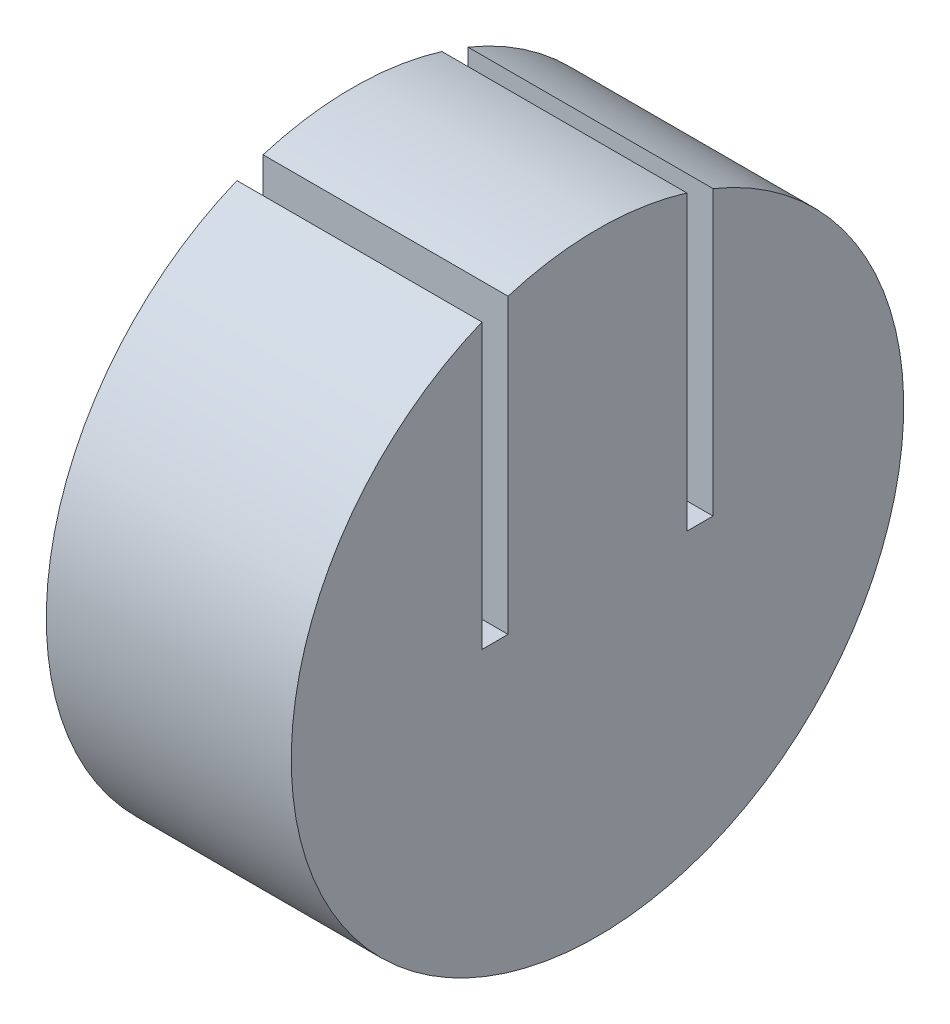
ISO-10303-21;
HEADER;
FILE_DESCRIPTION(('STEP AP214'),'2;1');
FILE_NAME('part.step','',(''),(''),'','','');
FILE_SCHEMA(('AUTOMOTIVE_DESIGN { 1 0 10303 214 1 1 1 1 }'));
ENDSEC;
DATA;
#1=APPLICATION_CONTEXT('core data for automotive mechanical design processes');
#2=APPLICATION_PROTOCOL_DEFINITION('international standard','automotive_design',2000,#1);
#3=PRODUCT_CONTEXT('',#1,'mechanical');
#4=PRODUCT('Part','Part','',(#3));
#5=PRODUCT_RELATED_PRODUCT_CATEGORY('part','',(#4));
#6=PRODUCT_DEFINITION_FORMATION('','',#4);
#7=PRODUCT_DEFINITION_CONTEXT('part definition',#1,'design');
#8=PRODUCT_DEFINITION('design','',#6,#7);
#9=PRODUCT_DEFINITION_SHAPE('','',#8);
#10=(LENGTH_UNIT() NAMED_UNIT(*) SI_UNIT(.MILLI.,.METRE.));
#11=(NAMED_UNIT(*) PLANE_ANGLE_UNIT() SI_UNIT($,.RADIAN.));
#12=(NAMED_UNIT(*) SI_UNIT($,.STERADIAN.) SOLID_ANGLE_UNIT());
#13=UNCERTAINTY_MEASURE_WITH_UNIT(LENGTH_MEASURE(1.E-05),#10,'distance_accuracy_value','');
#14=(GEOMETRIC_REPRESENTATION_CONTEXT(3) GLOBAL_UNCERTAINTY_ASSIGNED_CONTEXT((#13)) GLOBAL_UNIT_ASSIGNED_CONTEXT((#10,
#11,#12)) REPRESENTATION_CONTEXT('',''));
#15=CARTESIAN_POINT('',(0.,0.,0.));
#16=DIRECTION('',(0.,0.,1.));
#17=DIRECTION('',(1.,0.,0.));
#18=AXIS2_PLACEMENT_3D('',#15,#16,#17);
#19=CARTESIAN_POINT('',(7.62,0.,2.7813));
#20=DIRECTION('',(0.,0.,-1.));
#21=DIRECTION('',(0.,1.,0.));
#22=AXIS2_PLACEMENT_3D('',#19,#20,#21);
#23=PLANE('',#22);
#24=DIRECTION('',(0.,-1.,0.));
#25=VECTOR('',#24,1.);
#26=CARTESIAN_POINT('',(0.,0.,2.7813));
#27=LINE('',#26,#25);
#28=CARTESIAN_POINT('',(0.,9.10988448389989,2.7813));
#29=VERTEX_POINT('',#28);
#30=CARTESIAN_POINT('',(0.,0.,2.7813));
#31=VERTEX_POINT('',#30);
#32=EDGE_CURVE('E181',#29,#31,#27,.T.);
#33=ORIENTED_EDGE('',*,*,#32,.T.);
#34=DIRECTION('',(-1.,0.,0.));
#35=VECTOR('',#34,1.);
#36=CARTESIAN_POINT('',(7.62,0.,2.7813));
#37=LINE('',#36,#35);
#38=CARTESIAN_POINT('',(7.62,0.,2.7813));
#39=VERTEX_POINT('',#38);
#40=EDGE_CURVE('E11',#39,#31,#37,.T.);
#41=ORIENTED_EDGE('',*,*,#40,.F.);
#42=DIRECTION('',(0.,-1.,0.));
#43=VECTOR('',#42,1.);
#44=CARTESIAN_POINT('',(7.62,0.,2.7813));
#45=LINE('',#44,#43);
#46=CARTESIAN_POINT('',(7.62,9.10988448389989,2.7813));
#47=VERTEX_POINT('',#46);
#48=EDGE_CURVE('E97',#47,#39,#45,.T.);
#49=ORIENTED_EDGE('',*,*,#48,.F.);
#50=DIRECTION('',(-1.,0.,0.));
#51=VECTOR('',#50,1.);
#52=CARTESIAN_POINT('',(7.62,9.10988448389989,2.7813));
#53=LINE('',#52,#51);
#54=EDGE_CURVE('E154',#47,#29,#53,.T.);
#55=ORIENTED_EDGE('',*,*,#54,.T.);
#56=EDGE_LOOP('',(#33,#41,#49,#55));
#57=FACE_BOUND('',#56,.T.);
#58=ADVANCED_FACE('F41',(#57),#23,.F.);
#59=CARTESIAN_POINT('',(7.62,0.,0.));
#60=DIRECTION('',(0.,1.,0.));
#61=DIRECTION('',(0.,0.,1.));
#62=AXIS2_PLACEMENT_3D('',#59,#60,#61);
#63=PLANE('',#62);
#64=DIRECTION('',(0.,0.,-1.));
#65=VECTOR('',#64,1.);
#66=CARTESIAN_POINT('',(0.,0.,0.));
#67=LINE('',#66,#65);
#68=CARTESIAN_POINT('',(0.,0.,3.5941));
#69=VERTEX_POINT('',#68);
#70=EDGE_CURVE('E175',#69,#31,#67,.T.);
#71=ORIENTED_EDGE('',*,*,#70,.F.);
#72=DIRECTION('',(-1.,0.,0.));
#73=VECTOR('',#72,1.);
#74=CARTESIAN_POINT('',(7.62,0.,3.5941));
#75=LINE('',#74,#73);
#76=CARTESIAN_POINT('',(7.62,0.,3.5941));
#77=VERTEX_POINT('',#76);
#78=EDGE_CURVE('E50',#77,#69,#75,.T.);
#79=ORIENTED_EDGE('',*,*,#78,.F.);
#80=DIRECTION('',(0.,0.,-1.));
#81=VECTOR('',#80,1.);
#82=CARTESIAN_POINT('',(7.62,0.,0.));
#83=LINE('',#82,#81);
#84=EDGE_CURVE('E135',#77,#39,#83,.T.);
#85=ORIENTED_EDGE('',*,*,#84,.T.);
#86=ORIENTED_EDGE('',*,*,#40,.T.);
#87=EDGE_LOOP('',(#71,#79,#85,#86));
#88=FACE_BOUND('',#87,.T.);
#89=ADVANCED_FACE('F176',(#88),#63,.T.);
#90=CARTESIAN_POINT('',(7.62,0.,3.5941));
#91=DIRECTION('',(0.,0.,-1.));
#92=DIRECTION('',(0.,1.,0.));
#93=AXIS2_PLACEMENT_3D('',#90,#91,#92);
#94=PLANE('',#93);
#95=DIRECTION('',(0.,-1.,0.));
#96=VECTOR('',#95,1.);
#97=CARTESIAN_POINT('',(0.,0.,3.5941));
#98=LINE('',#97,#96);
#99=CARTESIAN_POINT('',(0.,8.82088828803539,3.5941));
#100=VERTEX_POINT('',#99);
#101=EDGE_CURVE('E172',#100,#69,#98,.T.);
#102=ORIENTED_EDGE('',*,*,#101,.F.);
#103=DIRECTION('',(-1.,0.,0.));
#104=VECTOR('',#103,1.);
#105=CARTESIAN_POINT('',(7.62,8.82088828803539,3.5941));
#106=LINE('',#105,#104);
#107=CARTESIAN_POINT('',(7.62,8.82088828803539,3.5941));
#108=VERTEX_POINT('',#107);
#109=EDGE_CURVE('E164',#108,#100,#106,.T.);
#110=ORIENTED_EDGE('',*,*,#109,.F.);
#111=DIRECTION('',(0.,-1.,0.));
#112=VECTOR('',#111,1.);
#113=CARTESIAN_POINT('',(7.62,0.,3.5941));
#114=LINE('',#113,#112);
#115=EDGE_CURVE('E143',#108,#77,#114,.T.);
#116=ORIENTED_EDGE('',*,*,#115,.T.);
#117=ORIENTED_EDGE('',*,*,#78,.T.);
#118=EDGE_LOOP('',(#102,#110,#116,#117));
#119=FACE_BOUND('',#118,.T.);
#120=ADVANCED_FACE('F170',(#119),#94,.T.);
#121=CARTESIAN_POINT('',(7.62,0.,0.));
#122=DIRECTION('',(-1.,0.,0.));
#123=DIRECTION('',(0.,0.,1.));
#124=AXIS2_PLACEMENT_3D('',#121,#122,#123);
#125=CYLINDRICAL_SURFACE('',#124,9.525);
#126=CARTESIAN_POINT('',(0.,0.,0.));
#127=DIRECTION('',(1.,0.,0.));
#128=DIRECTION('',(0.,0.,-1.));
#129=AXIS2_PLACEMENT_3D('',#126,#127,#128);
#130=CIRCLE('',#129,9.525);
#131=CARTESIAN_POINT('',(0.,8.82088828803539,-3.5941));
#132=VERTEX_POINT('',#131);
#133=EDGE_CURVE('E187',#100,#132,#130,.T.);
#134=ORIENTED_EDGE('',*,*,#133,.T.);
#135=DIRECTION('',(-1.,0.,0.));
#136=VECTOR('',#135,1.);
#137=CARTESIAN_POINT('',(7.62,8.82088828803539,-3.5941));
#138=LINE('',#137,#136);
#139=CARTESIAN_POINT('',(7.62,8.82088828803539,-3.5941));
#140=VERTEX_POINT('',#139);
#141=EDGE_CURVE('E161',#140,#132,#138,.T.);
#142=ORIENTED_EDGE('',*,*,#141,.F.);
#143=CARTESIAN_POINT('',(7.62,0.,0.));
#144=DIRECTION('',(1.,0.,0.));
#145=DIRECTION('',(0.,0.,-1.));
#146=AXIS2_PLACEMENT_3D('',#143,#144,#145);
#147=CIRCLE('',#146,9.525);
#148=EDGE_CURVE('E137',#108,#140,#147,.T.);
#149=ORIENTED_EDGE('',*,*,#148,.F.);
#150=ORIENTED_EDGE('',*,*,#109,.T.);
#151=EDGE_LOOP('',(#134,#142,#149,#150));
#152=FACE_BOUND('',#151,.T.);
#153=ADVANCED_FACE('F206',(#152),#125,.T.);
#154=CARTESIAN_POINT('',(7.62,0.,-3.5941));
#155=DIRECTION('',(0.,0.,1.));
#156=DIRECTION('',(0.,-1.,0.));
#157=AXIS2_PLACEMENT_3D('',#154,#155,#156);
#158=PLANE('',#157);
#159=DIRECTION('',(0.,1.,0.));
#160=VECTOR('',#159,1.);
#161=CARTESIAN_POINT('',(0.,0.,-3.5941));
#162=LINE('',#161,#160);
#163=CARTESIAN_POINT('',(0.,0.,-3.5941));
#164=VERTEX_POINT('',#163);
#165=EDGE_CURVE('E191',#164,#132,#162,.T.);
#166=ORIENTED_EDGE('',*,*,#165,.F.);
#167=DIRECTION('',(-1.,0.,0.));
#168=VECTOR('',#167,1.);
#169=CARTESIAN_POINT('',(7.62,0.,-3.5941));
#170=LINE('',#169,#168);
#171=CARTESIAN_POINT('',(7.62,0.,-3.5941));
#172=VERTEX_POINT('',#171);
#173=EDGE_CURVE('E122',#172,#164,#170,.T.);
#174=ORIENTED_EDGE('',*,*,#173,.F.);
#175=DIRECTION('',(0.,1.,0.));
#176=VECTOR('',#175,1.);
#177=CARTESIAN_POINT('',(7.62,0.,-3.5941));
#178=LINE('',#177,#176);
#179=EDGE_CURVE('E132',#172,#140,#178,.T.);
#180=ORIENTED_EDGE('',*,*,#179,.T.);
#181=ORIENTED_EDGE('',*,*,#141,.T.);
#182=EDGE_LOOP('',(#166,#174,#180,#181));
#183=FACE_BOUND('',#182,.T.);
#184=ADVANCED_FACE('F208',(#183),#158,.T.);
#185=CARTESIAN_POINT('',(0.,0.,-2.7813));
#186=VERTEX_POINT('',#185);
#187=EDGE_CURVE('E120',#186,#164,#67,.T.);
#188=ORIENTED_EDGE('',*,*,#187,.F.);
#189=DIRECTION('',(-1.,0.,0.));
#190=VECTOR('',#189,1.);
#191=CARTESIAN_POINT('',(7.62,0.,-2.7813));
#192=LINE('',#191,#190);
#193=CARTESIAN_POINT('',(7.62,0.,-2.7813));
#194=VERTEX_POINT('',#193);
#195=EDGE_CURVE('E114',#194,#186,#192,.T.);
#196=ORIENTED_EDGE('',*,*,#195,.F.);
#197=EDGE_CURVE('E118',#194,#172,#83,.T.);
#198=ORIENTED_EDGE('',*,*,#197,.T.);
#199=ORIENTED_EDGE('',*,*,#173,.T.);
#200=EDGE_LOOP('',(#188,#196,#198,#199));
#201=FACE_BOUND('',#200,.T.);
#202=ADVANCED_FACE('F116',(#201),#63,.T.);
#203=CARTESIAN_POINT('',(7.62,0.,-2.7813));
#204=DIRECTION('',(0.,0.,1.));
#205=DIRECTION('',(1.,0.,0.));
#206=AXIS2_PLACEMENT_3D('',#203,#204,#205);
#207=PLANE('',#206);
#208=DIRECTION('',(0.,1.,0.));
#209=VECTOR('',#208,1.);
#210=CARTESIAN_POINT('',(0.,0.,-2.7813));
#211=LINE('',#210,#209);
#212=CARTESIAN_POINT('',(0.,9.10988448389989,-2.7813));
#213=VERTEX_POINT('',#212);
#214=EDGE_CURVE('E85',#186,#213,#211,.T.);
#215=ORIENTED_EDGE('',*,*,#214,.T.);
#216=DIRECTION('',(-1.,0.,0.));
#217=VECTOR('',#216,1.);
#218=CARTESIAN_POINT('',(7.62,9.10988448389989,-2.7813));
#219=LINE('',#218,#217);
#220=CARTESIAN_POINT('',(7.62,9.10988448389989,-2.7813));
#221=VERTEX_POINT('',#220);
#222=EDGE_CURVE('E123',#221,#213,#219,.T.);
#223=ORIENTED_EDGE('',*,*,#222,.F.);
#224=DIRECTION('',(0.,1.,0.));
#225=VECTOR('',#224,1.);
#226=CARTESIAN_POINT('',(7.62,0.,-2.7813));
#227=LINE('',#226,#225);
#228=EDGE_CURVE('E125',#194,#221,#227,.T.);
#229=ORIENTED_EDGE('',*,*,#228,.F.);
#230=ORIENTED_EDGE('',*,*,#195,.T.);
#231=EDGE_LOOP('',(#215,#223,#229,#230));
#232=FACE_BOUND('',#231,.T.);
#233=ADVANCED_FACE('F126',(#232),#207,.F.);
#234=CARTESIAN_POINT('',(7.62,0.,0.));
#235=DIRECTION('',(-1.,0.,0.));
#236=DIRECTION('',(0.,0.,1.));
#237=AXIS2_PLACEMENT_3D('',#234,#235,#236);
#238=CYLINDRICAL_SURFACE('',#237,9.525);
#239=CARTESIAN_POINT('',(0.,0.,0.));
#240=DIRECTION('',(1.,0.,0.));
#241=DIRECTION('',(0.,0.,-1.));
#242=AXIS2_PLACEMENT_3D('',#239,#240,#241);
#243=CIRCLE('',#242,9.525);
#244=EDGE_CURVE('E91',#213,#29,#243,.T.);
#245=ORIENTED_EDGE('',*,*,#244,.T.);
#246=ORIENTED_EDGE('',*,*,#54,.F.);
#247=CARTESIAN_POINT('',(7.62,0.,0.));
#248=DIRECTION('',(1.,0.,0.));
#249=DIRECTION('',(0.,0.,-1.));
#250=AXIS2_PLACEMENT_3D('',#247,#248,#249);
#251=CIRCLE('',#250,9.525);
#252=EDGE_CURVE('E58',#221,#47,#251,.T.);
#253=ORIENTED_EDGE('',*,*,#252,.F.);
#254=ORIENTED_EDGE('',*,*,#222,.T.);
#255=EDGE_LOOP('',(#245,#246,#253,#254));
#256=FACE_BOUND('',#255,.T.);
#257=ADVANCED_FACE('F227',(#256),#238,.T.);
#258=CARTESIAN_POINT('',(7.62,0.,0.));
#259=DIRECTION('',(1.,0.,0.));
#260=DIRECTION('',(0.,0.,-1.));
#261=AXIS2_PLACEMENT_3D('',#258,#259,#260);
#262=PLANE('',#261);
#263=ORIENTED_EDGE('',*,*,#48,.T.);
#264=ORIENTED_EDGE('',*,*,#84,.F.);
#265=ORIENTED_EDGE('',*,*,#115,.F.);
#266=ORIENTED_EDGE('',*,*,#148,.T.);
#267=ORIENTED_EDGE('',*,*,#179,.F.);
#268=ORIENTED_EDGE('',*,*,#197,.F.);
#269=ORIENTED_EDGE('',*,*,#228,.T.);
#270=ORIENTED_EDGE('',*,*,#252,.T.);
#271=EDGE_LOOP('',(#263,#264,#265,#266,#267,#268,#269,#270));
#272=FACE_BOUND('',#271,.T.);
#273=ADVANCED_FACE('F130',(#272),#262,.T.);
#274=CARTESIAN_POINT('',(0.,0.,0.));
#275=DIRECTION('',(1.,0.,0.));
#276=DIRECTION('',(0.,0.,-1.));
#277=AXIS2_PLACEMENT_3D('',#274,#275,#276);
#278=PLANE('',#277);
#279=ORIENTED_EDGE('',*,*,#32,.F.);
#280=ORIENTED_EDGE('',*,*,#244,.F.);
#281=ORIENTED_EDGE('',*,*,#214,.F.);
#282=ORIENTED_EDGE('',*,*,#187,.T.);
#283=ORIENTED_EDGE('',*,*,#165,.T.);
#284=ORIENTED_EDGE('',*,*,#133,.F.);
#285=ORIENTED_EDGE('',*,*,#101,.T.);
#286=ORIENTED_EDGE('',*,*,#70,.T.);
#287=EDGE_LOOP('',(#279,#280,#281,#282,#283,#284,#285,#286));
#288=FACE_BOUND('',#287,.T.);
#289=ADVANCED_FACE('F184',(#288),#278,.F.);
#290=CLOSED_SHELL('',(#58,#89,#120,#153,#184,#202,#233,#257,#273,#289));
#291=MANIFOLD_SOLID_BREP('B2',#290);
#292=ADVANCED_BREP_SHAPE_REPRESENTATION('',(#18,#291),#14);
#293=SHAPE_DEFINITION_REPRESENTATION(#9,#292);
ENDSEC;
END-ISO-10303-21;
